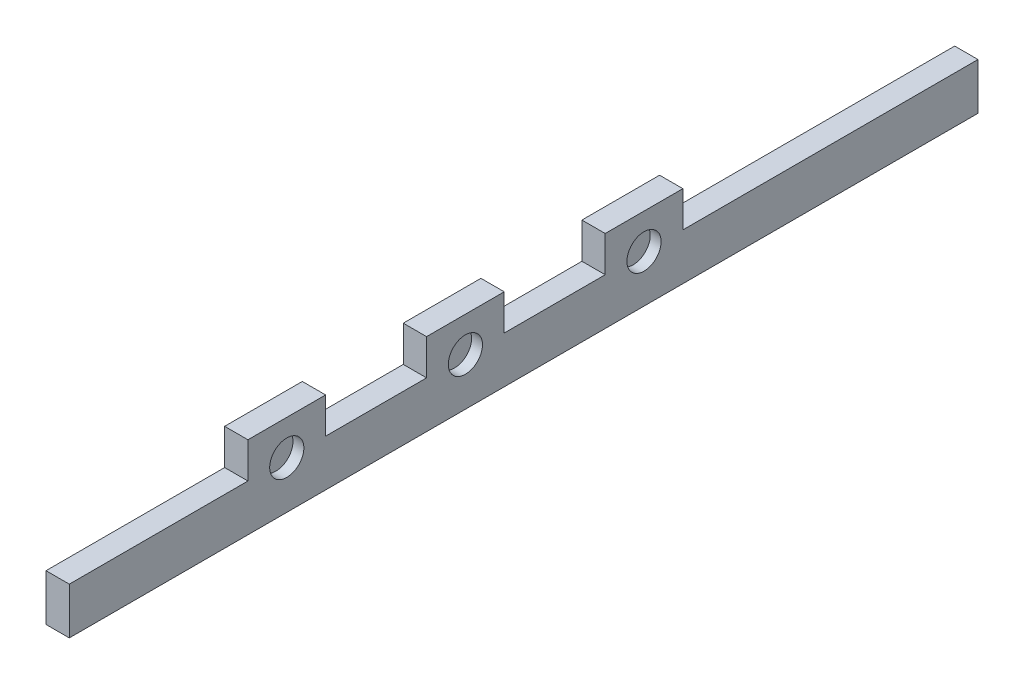
ISO-10303-21;
HEADER;
FILE_DESCRIPTION(('STEP AP214'),'2;1');
FILE_NAME('part.step','',(''),(''),'','','');
FILE_SCHEMA(('AUTOMOTIVE_DESIGN { 1 0 10303 214 1 1 1 1 }'));
ENDSEC;
DATA;
#1=APPLICATION_CONTEXT('core data for automotive mechanical design processes');
#2=APPLICATION_PROTOCOL_DEFINITION('international standard','automotive_design',2000,#1);
#3=PRODUCT_CONTEXT('',#1,'mechanical');
#4=PRODUCT('Part','Part','',(#3));
#5=PRODUCT_RELATED_PRODUCT_CATEGORY('part','',(#4));
#6=PRODUCT_DEFINITION_FORMATION('','',#4);
#7=PRODUCT_DEFINITION_CONTEXT('part definition',#1,'design');
#8=PRODUCT_DEFINITION('design','',#6,#7);
#9=PRODUCT_DEFINITION_SHAPE('','',#8);
#10=(LENGTH_UNIT() NAMED_UNIT(*) SI_UNIT(.MILLI.,.METRE.));
#11=(NAMED_UNIT(*) PLANE_ANGLE_UNIT() SI_UNIT($,.RADIAN.));
#12=(NAMED_UNIT(*) SI_UNIT($,.STERADIAN.) SOLID_ANGLE_UNIT());
#13=UNCERTAINTY_MEASURE_WITH_UNIT(LENGTH_MEASURE(1.E-05),#10,'distance_accuracy_value','');
#14=(GEOMETRIC_REPRESENTATION_CONTEXT(3) GLOBAL_UNCERTAINTY_ASSIGNED_CONTEXT((#13)) GLOBAL_UNIT_ASSIGNED_CONTEXT((#10,
#11,#12)) REPRESENTATION_CONTEXT('',''));
#15=CARTESIAN_POINT('',(0.,0.,0.));
#16=DIRECTION('',(0.,0.,1.));
#17=DIRECTION('',(1.,0.,0.));
#18=AXIS2_PLACEMENT_3D('',#15,#16,#17);
#19=CARTESIAN_POINT('',(15.,30.,12.5));
#20=DIRECTION('',(0.,0.,1.));
#21=DIRECTION('',(1.,0.,0.));
#22=AXIS2_PLACEMENT_3D('',#19,#20,#21);
#23=PLANE('',#22);
#24=DIRECTION('',(0.,1.,0.));
#25=VECTOR('',#24,1.);
#26=CARTESIAN_POINT('',(0.,30.,12.5));
#27=LINE('',#26,#25);
#28=CARTESIAN_POINT('',(0.,30.,12.5));
#29=VERTEX_POINT('',#28);
#30=CARTESIAN_POINT('',(0.,53.,12.5));
#31=VERTEX_POINT('',#30);
#32=EDGE_CURVE('E177',#29,#31,#27,.T.);
#33=ORIENTED_EDGE('',*,*,#32,.T.);
#34=DIRECTION('',(-1.,0.,0.));
#35=VECTOR('',#34,1.);
#36=CARTESIAN_POINT('',(15.,53.,12.5));
#37=LINE('',#36,#35);
#38=CARTESIAN_POINT('',(15.,53.,12.5));
#39=VERTEX_POINT('',#38);
#40=EDGE_CURVE('E11',#39,#31,#37,.T.);
#41=ORIENTED_EDGE('',*,*,#40,.F.);
#42=DIRECTION('',(0.,1.,0.));
#43=VECTOR('',#42,1.);
#44=CARTESIAN_POINT('',(15.,30.,12.5));
#45=LINE('',#44,#43);
#46=CARTESIAN_POINT('',(15.,30.,12.5));
#47=VERTEX_POINT('',#46);
#48=EDGE_CURVE('E208',#47,#39,#45,.T.);
#49=ORIENTED_EDGE('',*,*,#48,.F.);
#50=DIRECTION('',(-1.,0.,0.));
#51=VECTOR('',#50,1.);
#52=CARTESIAN_POINT('',(15.,30.,12.5));
#53=LINE('',#52,#51);
#54=EDGE_CURVE('E173',#47,#29,#53,.T.);
#55=ORIENTED_EDGE('',*,*,#54,.T.);
#56=EDGE_LOOP('',(#33,#41,#49,#55));
#57=FACE_BOUND('',#56,.T.);
#58=ADVANCED_FACE('F33',(#57),#23,.F.);
#59=CARTESIAN_POINT('',(15.,53.,62.5));
#60=DIRECTION('',(0.,-1.,0.));
#61=DIRECTION('',(0.,0.,-1.));
#62=AXIS2_PLACEMENT_3D('',#59,#60,#61);
#63=PLANE('',#62);
#64=DIRECTION('',(0.,0.,1.));
#65=VECTOR('',#64,1.);
#66=CARTESIAN_POINT('',(0.,53.,62.5));
#67=LINE('',#66,#65);
#68=CARTESIAN_POINT('',(0.,53.,62.5));
#69=VERTEX_POINT('',#68);
#70=EDGE_CURVE('E180',#31,#69,#67,.T.);
#71=ORIENTED_EDGE('',*,*,#70,.T.);
#72=DIRECTION('',(-1.,0.,0.));
#73=VECTOR('',#72,1.);
#74=CARTESIAN_POINT('',(15.,53.,62.5));
#75=LINE('',#74,#73);
#76=CARTESIAN_POINT('',(15.,53.,62.5));
#77=VERTEX_POINT('',#76);
#78=EDGE_CURVE('E41',#77,#69,#75,.T.);
#79=ORIENTED_EDGE('',*,*,#78,.F.);
#80=DIRECTION('',(0.,0.,1.));
#81=VECTOR('',#80,1.);
#82=CARTESIAN_POINT('',(15.,53.,62.5));
#83=LINE('',#82,#81);
#84=EDGE_CURVE('E116',#39,#77,#83,.T.);
#85=ORIENTED_EDGE('',*,*,#84,.F.);
#86=ORIENTED_EDGE('',*,*,#40,.T.);
#87=EDGE_LOOP('',(#71,#79,#85,#86));
#88=FACE_BOUND('',#87,.T.);
#89=ADVANCED_FACE('F307',(#88),#63,.F.);
#90=CARTESIAN_POINT('',(15.,30.,62.5));
#91=DIRECTION('',(0.,0.,-1.));
#92=DIRECTION('',(-1.,0.,0.));
#93=AXIS2_PLACEMENT_3D('',#90,#91,#92);
#94=PLANE('',#93);
#95=DIRECTION('',(0.,-1.,0.));
#96=VECTOR('',#95,1.);
#97=CARTESIAN_POINT('',(0.,30.,62.5));
#98=LINE('',#97,#96);
#99=CARTESIAN_POINT('',(0.,30.,62.5));
#100=VERTEX_POINT('',#99);
#101=EDGE_CURVE('E183',#69,#100,#98,.T.);
#102=ORIENTED_EDGE('',*,*,#101,.T.);
#103=DIRECTION('',(-1.,0.,0.));
#104=VECTOR('',#103,1.);
#105=CARTESIAN_POINT('',(15.,30.,62.5));
#106=LINE('',#105,#104);
#107=CARTESIAN_POINT('',(15.,30.,62.5));
#108=VERTEX_POINT('',#107);
#109=EDGE_CURVE('E239',#108,#100,#106,.T.);
#110=ORIENTED_EDGE('',*,*,#109,.F.);
#111=DIRECTION('',(0.,-1.,0.));
#112=VECTOR('',#111,1.);
#113=CARTESIAN_POINT('',(15.,30.,62.5));
#114=LINE('',#113,#112);
#115=EDGE_CURVE('E247',#77,#108,#114,.T.);
#116=ORIENTED_EDGE('',*,*,#115,.F.);
#117=ORIENTED_EDGE('',*,*,#78,.T.);
#118=EDGE_LOOP('',(#102,#110,#116,#117));
#119=FACE_BOUND('',#118,.T.);
#120=ADVANCED_FACE('F245',(#119),#94,.F.);
#121=CARTESIAN_POINT('',(15.,30.,62.5));
#122=DIRECTION('',(0.,-1.,0.));
#123=DIRECTION('',(0.,0.,-1.));
#124=AXIS2_PLACEMENT_3D('',#121,#122,#123);
#125=PLANE('',#124);
#126=DIRECTION('',(0.,0.,1.));
#127=VECTOR('',#126,1.);
#128=CARTESIAN_POINT('',(0.,30.,62.5));
#129=LINE('',#128,#127);
#130=CARTESIAN_POINT('',(0.,30.,127.5));
#131=VERTEX_POINT('',#130);
#132=EDGE_CURVE('E185',#100,#131,#129,.T.);
#133=ORIENTED_EDGE('',*,*,#132,.T.);
#134=DIRECTION('',(-1.,0.,0.));
#135=VECTOR('',#134,1.);
#136=CARTESIAN_POINT('',(15.,30.,127.5));
#137=LINE('',#136,#135);
#138=CARTESIAN_POINT('',(15.,30.,127.5));
#139=VERTEX_POINT('',#138);
#140=EDGE_CURVE('E236',#139,#131,#137,.T.);
#141=ORIENTED_EDGE('',*,*,#140,.F.);
#142=DIRECTION('',(0.,0.,1.));
#143=VECTOR('',#142,1.);
#144=CARTESIAN_POINT('',(15.,30.,62.5));
#145=LINE('',#144,#143);
#146=EDGE_CURVE('E265',#108,#139,#145,.T.);
#147=ORIENTED_EDGE('',*,*,#146,.F.);
#148=ORIENTED_EDGE('',*,*,#109,.T.);
#149=EDGE_LOOP('',(#133,#141,#147,#148));
#150=FACE_BOUND('',#149,.T.);
#151=ADVANCED_FACE('F256',(#150),#125,.F.);
#152=CARTESIAN_POINT('',(15.,30.,127.5));
#153=DIRECTION('',(0.,0.,1.));
#154=DIRECTION('',(1.,0.,0.));
#155=AXIS2_PLACEMENT_3D('',#152,#153,#154);
#156=PLANE('',#155);
#157=DIRECTION('',(0.,1.,0.));
#158=VECTOR('',#157,1.);
#159=CARTESIAN_POINT('',(0.,30.,127.5));
#160=LINE('',#159,#158);
#161=CARTESIAN_POINT('',(0.,53.,127.5));
#162=VERTEX_POINT('',#161);
#163=EDGE_CURVE('E187',#131,#162,#160,.T.);
#164=ORIENTED_EDGE('',*,*,#163,.T.);
#165=DIRECTION('',(-1.,0.,0.));
#166=VECTOR('',#165,1.);
#167=CARTESIAN_POINT('',(15.,53.,127.5));
#168=LINE('',#167,#166);
#169=CARTESIAN_POINT('',(15.,53.,127.5));
#170=VERTEX_POINT('',#169);
#171=EDGE_CURVE('E233',#170,#162,#168,.T.);
#172=ORIENTED_EDGE('',*,*,#171,.F.);
#173=DIRECTION('',(0.,1.,0.));
#174=VECTOR('',#173,1.);
#175=CARTESIAN_POINT('',(15.,30.,127.5));
#176=LINE('',#175,#174);
#177=EDGE_CURVE('E262',#139,#170,#176,.T.);
#178=ORIENTED_EDGE('',*,*,#177,.F.);
#179=ORIENTED_EDGE('',*,*,#140,.T.);
#180=EDGE_LOOP('',(#164,#172,#178,#179));
#181=FACE_BOUND('',#180,.T.);
#182=ADVANCED_FACE('F260',(#181),#156,.F.);
#183=CARTESIAN_POINT('',(15.,53.,177.5));
#184=DIRECTION('',(0.,-1.,0.));
#185=DIRECTION('',(0.,0.,-1.));
#186=AXIS2_PLACEMENT_3D('',#183,#184,#185);
#187=PLANE('',#186);
#188=DIRECTION('',(0.,0.,1.));
#189=VECTOR('',#188,1.);
#190=CARTESIAN_POINT('',(0.,53.,177.5));
#191=LINE('',#190,#189);
#192=CARTESIAN_POINT('',(0.,53.,177.5));
#193=VERTEX_POINT('',#192);
#194=EDGE_CURVE('E189',#162,#193,#191,.T.);
#195=ORIENTED_EDGE('',*,*,#194,.T.);
#196=DIRECTION('',(-1.,0.,0.));
#197=VECTOR('',#196,1.);
#198=CARTESIAN_POINT('',(15.,53.,177.5));
#199=LINE('',#198,#197);
#200=CARTESIAN_POINT('',(15.,53.,177.5));
#201=VERTEX_POINT('',#200);
#202=EDGE_CURVE('E230',#201,#193,#199,.T.);
#203=ORIENTED_EDGE('',*,*,#202,.F.);
#204=DIRECTION('',(0.,0.,1.));
#205=VECTOR('',#204,1.);
#206=CARTESIAN_POINT('',(15.,53.,177.5));
#207=LINE('',#206,#205);
#208=EDGE_CURVE('E264',#170,#201,#207,.T.);
#209=ORIENTED_EDGE('',*,*,#208,.F.);
#210=ORIENTED_EDGE('',*,*,#171,.T.);
#211=EDGE_LOOP('',(#195,#203,#209,#210));
#212=FACE_BOUND('',#211,.T.);
#213=ADVANCED_FACE('F320',(#212),#187,.F.);
#214=CARTESIAN_POINT('',(15.,30.,177.5));
#215=DIRECTION('',(0.,0.,-1.));
#216=DIRECTION('',(-1.,0.,0.));
#217=AXIS2_PLACEMENT_3D('',#214,#215,#216);
#218=PLANE('',#217);
#219=DIRECTION('',(0.,-1.,0.));
#220=VECTOR('',#219,1.);
#221=CARTESIAN_POINT('',(0.,30.,177.5));
#222=LINE('',#221,#220);
#223=CARTESIAN_POINT('',(0.,30.,177.5));
#224=VERTEX_POINT('',#223);
#225=EDGE_CURVE('E191',#193,#224,#222,.T.);
#226=ORIENTED_EDGE('',*,*,#225,.T.);
#227=DIRECTION('',(-1.,0.,0.));
#228=VECTOR('',#227,1.);
#229=CARTESIAN_POINT('',(15.,30.,177.5));
#230=LINE('',#229,#228);
#231=CARTESIAN_POINT('',(15.,30.,177.5));
#232=VERTEX_POINT('',#231);
#233=EDGE_CURVE('E227',#232,#224,#230,.T.);
#234=ORIENTED_EDGE('',*,*,#233,.F.);
#235=DIRECTION('',(0.,-1.,0.));
#236=VECTOR('',#235,1.);
#237=CARTESIAN_POINT('',(15.,30.,177.5));
#238=LINE('',#237,#236);
#239=EDGE_CURVE('E267',#201,#232,#238,.T.);
#240=ORIENTED_EDGE('',*,*,#239,.F.);
#241=ORIENTED_EDGE('',*,*,#202,.T.);
#242=EDGE_LOOP('',(#226,#234,#240,#241));
#243=FACE_BOUND('',#242,.T.);
#244=ADVANCED_FACE('F323',(#243),#218,.F.);
#245=CARTESIAN_POINT('',(15.,30.,177.5));
#246=DIRECTION('',(0.,-1.,0.));
#247=DIRECTION('',(0.,0.,-1.));
#248=AXIS2_PLACEMENT_3D('',#245,#246,#247);
#249=PLANE('',#248);
#250=DIRECTION('',(0.,0.,1.));
#251=VECTOR('',#250,1.);
#252=CARTESIAN_POINT('',(0.,30.,177.5));
#253=LINE('',#252,#251);
#254=CARTESIAN_POINT('',(0.,30.,292.5));
#255=VERTEX_POINT('',#254);
#256=EDGE_CURVE('E193',#224,#255,#253,.T.);
#257=ORIENTED_EDGE('',*,*,#256,.T.);
#258=DIRECTION('',(-1.,0.,0.));
#259=VECTOR('',#258,1.);
#260=CARTESIAN_POINT('',(15.,30.,292.5));
#261=LINE('',#260,#259);
#262=CARTESIAN_POINT('',(15.,30.,292.5));
#263=VERTEX_POINT('',#262);
#264=EDGE_CURVE('E224',#263,#255,#261,.T.);
#265=ORIENTED_EDGE('',*,*,#264,.F.);
#266=DIRECTION('',(0.,0.,1.));
#267=VECTOR('',#266,1.);
#268=CARTESIAN_POINT('',(15.,30.,177.5));
#269=LINE('',#268,#267);
#270=EDGE_CURVE('E273',#232,#263,#269,.T.);
#271=ORIENTED_EDGE('',*,*,#270,.F.);
#272=ORIENTED_EDGE('',*,*,#233,.T.);
#273=EDGE_LOOP('',(#257,#265,#271,#272));
#274=FACE_BOUND('',#273,.T.);
#275=ADVANCED_FACE('F327',(#274),#249,.F.);
#276=CARTESIAN_POINT('',(15.,0.,292.5));
#277=DIRECTION('',(0.,0.,-1.));
#278=DIRECTION('',(-1.,0.,0.));
#279=AXIS2_PLACEMENT_3D('',#276,#277,#278);
#280=PLANE('',#279);
#281=DIRECTION('',(0.,-1.,0.));
#282=VECTOR('',#281,1.);
#283=CARTESIAN_POINT('',(0.,0.,292.5));
#284=LINE('',#283,#282);
#285=CARTESIAN_POINT('',(0.,0.,292.5));
#286=VERTEX_POINT('',#285);
#287=EDGE_CURVE('E195',#255,#286,#284,.T.);
#288=ORIENTED_EDGE('',*,*,#287,.T.);
#289=DIRECTION('',(-1.,0.,0.));
#290=VECTOR('',#289,1.);
#291=CARTESIAN_POINT('',(15.,0.,292.5));
#292=LINE('',#291,#290);
#293=CARTESIAN_POINT('',(15.,0.,292.5));
#294=VERTEX_POINT('',#293);
#295=EDGE_CURVE('E221',#294,#286,#292,.T.);
#296=ORIENTED_EDGE('',*,*,#295,.F.);
#297=DIRECTION('',(0.,-1.,0.));
#298=VECTOR('',#297,1.);
#299=CARTESIAN_POINT('',(15.,0.,292.5));
#300=LINE('',#299,#298);
#301=EDGE_CURVE('E275',#263,#294,#300,.T.);
#302=ORIENTED_EDGE('',*,*,#301,.F.);
#303=ORIENTED_EDGE('',*,*,#264,.T.);
#304=EDGE_LOOP('',(#288,#296,#302,#303));
#305=FACE_BOUND('',#304,.T.);
#306=ADVANCED_FACE('F331',(#305),#280,.F.);
#307=CARTESIAN_POINT('',(15.,0.,292.5));
#308=DIRECTION('',(0.,1.,0.));
#309=DIRECTION('',(0.,0.,1.));
#310=AXIS2_PLACEMENT_3D('',#307,#308,#309);
#311=PLANE('',#310);
#312=DIRECTION('',(0.,0.,-1.));
#313=VECTOR('',#312,1.);
#314=CARTESIAN_POINT('',(0.,0.,292.5));
#315=LINE('',#314,#313);
#316=CARTESIAN_POINT('',(0.,1.0746275662518E-13,-292.5));
#317=VERTEX_POINT('',#316);
#318=EDGE_CURVE('E197',#286,#317,#315,.T.);
#319=ORIENTED_EDGE('',*,*,#318,.T.);
#320=DIRECTION('',(-1.,0.,0.));
#321=VECTOR('',#320,1.);
#322=CARTESIAN_POINT('',(15.,1.0746275662518E-13,-292.5));
#323=LINE('',#322,#321);
#324=CARTESIAN_POINT('',(15.,1.0746275662518E-13,-292.5));
#325=VERTEX_POINT('',#324);
#326=EDGE_CURVE('E218',#325,#317,#323,.T.);
#327=ORIENTED_EDGE('',*,*,#326,.F.);
#328=DIRECTION('',(0.,0.,-1.));
#329=VECTOR('',#328,1.);
#330=CARTESIAN_POINT('',(15.,0.,292.5));
#331=LINE('',#330,#329);
#332=EDGE_CURVE('E277',#294,#325,#331,.T.);
#333=ORIENTED_EDGE('',*,*,#332,.F.);
#334=ORIENTED_EDGE('',*,*,#295,.T.);
#335=EDGE_LOOP('',(#319,#327,#333,#334));
#336=FACE_BOUND('',#335,.T.);
#337=ADVANCED_FACE('F335',(#336),#311,.F.);
#338=CARTESIAN_POINT('',(15.,1.0746275662518E-13,-292.5));
#339=DIRECTION('',(0.,0.,1.));
#340=DIRECTION('',(1.,0.,0.));
#341=AXIS2_PLACEMENT_3D('',#338,#339,#340);
#342=PLANE('',#341);
#343=DIRECTION('',(0.,1.,0.));
#344=VECTOR('',#343,1.);
#345=CARTESIAN_POINT('',(0.,1.0746275662518E-13,-292.5));
#346=LINE('',#345,#344);
#347=CARTESIAN_POINT('',(0.,30.0000000000001,-292.5));
#348=VERTEX_POINT('',#347);
#349=EDGE_CURVE('E199',#317,#348,#346,.T.);
#350=ORIENTED_EDGE('',*,*,#349,.T.);
#351=DIRECTION('',(-1.,0.,0.));
#352=VECTOR('',#351,1.);
#353=CARTESIAN_POINT('',(15.,30.0000000000001,-292.5));
#354=LINE('',#353,#352);
#355=CARTESIAN_POINT('',(15.,30.0000000000001,-292.5));
#356=VERTEX_POINT('',#355);
#357=EDGE_CURVE('E215',#356,#348,#354,.T.);
#358=ORIENTED_EDGE('',*,*,#357,.F.);
#359=DIRECTION('',(0.,1.,0.));
#360=VECTOR('',#359,1.);
#361=CARTESIAN_POINT('',(15.,1.0746275662518E-13,-292.5));
#362=LINE('',#361,#360);
#363=EDGE_CURVE('E279',#325,#356,#362,.T.);
#364=ORIENTED_EDGE('',*,*,#363,.F.);
#365=ORIENTED_EDGE('',*,*,#326,.T.);
#366=EDGE_LOOP('',(#350,#358,#364,#365));
#367=FACE_BOUND('',#366,.T.);
#368=ADVANCED_FACE('F339',(#367),#342,.F.);
#369=CARTESIAN_POINT('',(15.,30.,-102.5));
#370=DIRECTION('',(0.,-1.,0.));
#371=DIRECTION('',(0.,0.,-1.));
#372=AXIS2_PLACEMENT_3D('',#369,#370,#371);
#373=PLANE('',#372);
#374=DIRECTION('',(0.,0.,1.));
#375=VECTOR('',#374,1.);
#376=CARTESIAN_POINT('',(0.,30.,-102.5));
#377=LINE('',#376,#375);
#378=CARTESIAN_POINT('',(0.,30.,-102.5));
#379=VERTEX_POINT('',#378);
#380=EDGE_CURVE('E201',#348,#379,#377,.T.);
#381=ORIENTED_EDGE('',*,*,#380,.T.);
#382=DIRECTION('',(-1.,0.,0.));
#383=VECTOR('',#382,1.);
#384=CARTESIAN_POINT('',(15.,30.,-102.5));
#385=LINE('',#384,#383);
#386=CARTESIAN_POINT('',(15.,30.,-102.5));
#387=VERTEX_POINT('',#386);
#388=EDGE_CURVE('E212',#387,#379,#385,.T.);
#389=ORIENTED_EDGE('',*,*,#388,.F.);
#390=DIRECTION('',(0.,0.,1.));
#391=VECTOR('',#390,1.);
#392=CARTESIAN_POINT('',(15.,30.,-102.5));
#393=LINE('',#392,#391);
#394=EDGE_CURVE('E281',#356,#387,#393,.T.);
#395=ORIENTED_EDGE('',*,*,#394,.F.);
#396=ORIENTED_EDGE('',*,*,#357,.T.);
#397=EDGE_LOOP('',(#381,#389,#395,#396));
#398=FACE_BOUND('',#397,.T.);
#399=ADVANCED_FACE('F287',(#398),#373,.F.);
#400=CARTESIAN_POINT('',(15.,30.,-102.5));
#401=DIRECTION('',(0.,0.,1.));
#402=DIRECTION('',(1.,0.,0.));
#403=AXIS2_PLACEMENT_3D('',#400,#401,#402);
#404=PLANE('',#403);
#405=DIRECTION('',(0.,1.,0.));
#406=VECTOR('',#405,1.);
#407=CARTESIAN_POINT('',(0.,30.,-102.5));
#408=LINE('',#407,#406);
#409=CARTESIAN_POINT('',(0.,53.,-102.5));
#410=VERTEX_POINT('',#409);
#411=EDGE_CURVE('E203',#379,#410,#408,.T.);
#412=ORIENTED_EDGE('',*,*,#411,.T.);
#413=DIRECTION('',(-1.,0.,0.));
#414=VECTOR('',#413,1.);
#415=CARTESIAN_POINT('',(15.,53.,-102.5));
#416=LINE('',#415,#414);
#417=CARTESIAN_POINT('',(15.,53.,-102.5));
#418=VERTEX_POINT('',#417);
#419=EDGE_CURVE('E168',#418,#410,#416,.T.);
#420=ORIENTED_EDGE('',*,*,#419,.F.);
#421=DIRECTION('',(0.,1.,0.));
#422=VECTOR('',#421,1.);
#423=CARTESIAN_POINT('',(15.,30.,-102.5));
#424=LINE('',#423,#422);
#425=EDGE_CURVE('E159',#387,#418,#424,.T.);
#426=ORIENTED_EDGE('',*,*,#425,.F.);
#427=ORIENTED_EDGE('',*,*,#388,.T.);
#428=EDGE_LOOP('',(#412,#420,#426,#427));
#429=FACE_BOUND('',#428,.T.);
#430=ADVANCED_FACE('F291',(#429),#404,.F.);
#431=CARTESIAN_POINT('',(15.,53.,-52.5));
#432=DIRECTION('',(0.,-1.,0.));
#433=DIRECTION('',(0.,0.,-1.));
#434=AXIS2_PLACEMENT_3D('',#431,#432,#433);
#435=PLANE('',#434);
#436=DIRECTION('',(0.,0.,1.));
#437=VECTOR('',#436,1.);
#438=CARTESIAN_POINT('',(0.,53.,-52.5));
#439=LINE('',#438,#437);
#440=CARTESIAN_POINT('',(0.,53.,-52.5));
#441=VERTEX_POINT('',#440);
#442=EDGE_CURVE('E167',#410,#441,#439,.T.);
#443=ORIENTED_EDGE('',*,*,#442,.T.);
#444=DIRECTION('',(-1.,0.,0.));
#445=VECTOR('',#444,1.);
#446=CARTESIAN_POINT('',(15.,53.,-52.5));
#447=LINE('',#446,#445);
#448=CARTESIAN_POINT('',(15.,53.,-52.5));
#449=VERTEX_POINT('',#448);
#450=EDGE_CURVE('E164',#449,#441,#447,.T.);
#451=ORIENTED_EDGE('',*,*,#450,.F.);
#452=DIRECTION('',(0.,0.,1.));
#453=VECTOR('',#452,1.);
#454=CARTESIAN_POINT('',(15.,53.,-52.5));
#455=LINE('',#454,#453);
#456=EDGE_CURVE('E153',#418,#449,#455,.T.);
#457=ORIENTED_EDGE('',*,*,#456,.F.);
#458=ORIENTED_EDGE('',*,*,#419,.T.);
#459=EDGE_LOOP('',(#443,#451,#457,#458));
#460=FACE_BOUND('',#459,.T.);
#461=ADVANCED_FACE('F165',(#460),#435,.F.);
#462=CARTESIAN_POINT('',(15.,30.,-52.5));
#463=DIRECTION('',(0.,0.,-1.));
#464=DIRECTION('',(-1.,0.,0.));
#465=AXIS2_PLACEMENT_3D('',#462,#463,#464);
#466=PLANE('',#465);
#467=DIRECTION('',(0.,-1.,0.));
#468=VECTOR('',#467,1.);
#469=CARTESIAN_POINT('',(0.,30.,-52.5));
#470=LINE('',#469,#468);
#471=CARTESIAN_POINT('',(0.,30.,-52.5));
#472=VERTEX_POINT('',#471);
#473=EDGE_CURVE('E102',#441,#472,#470,.T.);
#474=ORIENTED_EDGE('',*,*,#473,.T.);
#475=DIRECTION('',(-1.,0.,0.));
#476=VECTOR('',#475,1.);
#477=CARTESIAN_POINT('',(15.,30.,-52.5));
#478=LINE('',#477,#476);
#479=CARTESIAN_POINT('',(15.,30.,-52.5));
#480=VERTEX_POINT('',#479);
#481=EDGE_CURVE('E169',#480,#472,#478,.T.);
#482=ORIENTED_EDGE('',*,*,#481,.F.);
#483=DIRECTION('',(0.,-1.,0.));
#484=VECTOR('',#483,1.);
#485=CARTESIAN_POINT('',(15.,30.,-52.5));
#486=LINE('',#485,#484);
#487=EDGE_CURVE('E157',#449,#480,#486,.T.);
#488=ORIENTED_EDGE('',*,*,#487,.F.);
#489=ORIENTED_EDGE('',*,*,#450,.T.);
#490=EDGE_LOOP('',(#474,#482,#488,#489));
#491=FACE_BOUND('',#490,.T.);
#492=ADVANCED_FACE('F171',(#491),#466,.F.);
#493=CARTESIAN_POINT('',(15.,30.,12.5));
#494=DIRECTION('',(0.,-1.,0.));
#495=DIRECTION('',(0.,0.,-1.));
#496=AXIS2_PLACEMENT_3D('',#493,#494,#495);
#497=PLANE('',#496);
#498=DIRECTION('',(0.,0.,1.));
#499=VECTOR('',#498,1.);
#500=CARTESIAN_POINT('',(0.,30.,12.5));
#501=LINE('',#500,#499);
#502=EDGE_CURVE('E108',#472,#29,#501,.T.);
#503=ORIENTED_EDGE('',*,*,#502,.T.);
#504=ORIENTED_EDGE('',*,*,#54,.F.);
#505=DIRECTION('',(0.,0.,1.));
#506=VECTOR('',#505,1.);
#507=CARTESIAN_POINT('',(15.,30.,12.5));
#508=LINE('',#507,#506);
#509=EDGE_CURVE('E49',#480,#47,#508,.T.);
#510=ORIENTED_EDGE('',*,*,#509,.F.);
#511=ORIENTED_EDGE('',*,*,#481,.T.);
#512=EDGE_LOOP('',(#503,#504,#510,#511));
#513=FACE_BOUND('',#512,.T.);
#514=ADVANCED_FACE('F295',(#513),#497,.F.);
#515=CARTESIAN_POINT('',(15.,0.,0.));
#516=DIRECTION('',(-1.,0.,0.));
#517=DIRECTION('',(0.,0.,1.));
#518=AXIS2_PLACEMENT_3D('',#515,#516,#517);
#519=PLANE('',#518);
#520=CARTESIAN_POINT('',(15.,30.5,-77.5));
#521=DIRECTION('',(1.,0.,0.));
#522=DIRECTION('',(0.,0.,-1.));
#523=AXIS2_PLACEMENT_3D('',#520,#521,#522);
#524=CIRCLE('',#523,11.);
#525=CARTESIAN_POINT('',(15.,30.5,-88.5));
#526=VERTEX_POINT('',#525);
#527=EDGE_CURVE('E442',#526,#526,#524,.T.);
#528=ORIENTED_EDGE('',*,*,#527,.F.);
#529=EDGE_LOOP('',(#528));
#530=FACE_BOUND('',#529,.T.);
#531=CARTESIAN_POINT('',(15.,30.5,152.5));
#532=DIRECTION('',(1.,0.,0.));
#533=DIRECTION('',(0.,0.,-1.));
#534=AXIS2_PLACEMENT_3D('',#531,#532,#533);
#535=CIRCLE('',#534,11.);
#536=CARTESIAN_POINT('',(15.,30.5,141.5));
#537=VERTEX_POINT('',#536);
#538=EDGE_CURVE('E441',#537,#537,#535,.T.);
#539=ORIENTED_EDGE('',*,*,#538,.F.);
#540=EDGE_LOOP('',(#539));
#541=FACE_BOUND('',#540,.T.);
#542=CARTESIAN_POINT('',(15.,30.5,37.5));
#543=DIRECTION('',(1.,0.,0.));
#544=DIRECTION('',(0.,0.,-1.));
#545=AXIS2_PLACEMENT_3D('',#542,#543,#544);
#546=CIRCLE('',#545,11.);
#547=CARTESIAN_POINT('',(15.,30.5,26.5));
#548=VERTEX_POINT('',#547);
#549=EDGE_CURVE('E451',#548,#548,#546,.T.);
#550=ORIENTED_EDGE('',*,*,#549,.F.);
#551=EDGE_LOOP('',(#550));
#552=FACE_BOUND('',#551,.T.);
#553=ORIENTED_EDGE('',*,*,#48,.T.);
#554=ORIENTED_EDGE('',*,*,#84,.T.);
#555=ORIENTED_EDGE('',*,*,#115,.T.);
#556=ORIENTED_EDGE('',*,*,#146,.T.);
#557=ORIENTED_EDGE('',*,*,#177,.T.);
#558=ORIENTED_EDGE('',*,*,#208,.T.);
#559=ORIENTED_EDGE('',*,*,#239,.T.);
#560=ORIENTED_EDGE('',*,*,#270,.T.);
#561=ORIENTED_EDGE('',*,*,#301,.T.);
#562=ORIENTED_EDGE('',*,*,#332,.T.);
#563=ORIENTED_EDGE('',*,*,#363,.T.);
#564=ORIENTED_EDGE('',*,*,#394,.T.);
#565=ORIENTED_EDGE('',*,*,#425,.T.);
#566=ORIENTED_EDGE('',*,*,#456,.T.);
#567=ORIENTED_EDGE('',*,*,#487,.T.);
#568=ORIENTED_EDGE('',*,*,#509,.T.);
#569=EDGE_LOOP('',(#553,#554,#555,#556,#557,#558,#559,#560,#561,#562,#563,#564,#565,#566,#567,#568));
#570=FACE_BOUND('',#569,.T.);
#571=ADVANCED_FACE('F155',(#530,#541,#552,#570),#519,.F.);
#572=CARTESIAN_POINT('',(0.,0.,0.));
#573=DIRECTION('',(-1.,0.,0.));
#574=DIRECTION('',(0.,0.,1.));
#575=AXIS2_PLACEMENT_3D('',#572,#573,#574);
#576=PLANE('',#575);
#577=ORIENTED_EDGE('',*,*,#32,.F.);
#578=ORIENTED_EDGE('',*,*,#502,.F.);
#579=ORIENTED_EDGE('',*,*,#473,.F.);
#580=ORIENTED_EDGE('',*,*,#442,.F.);
#581=ORIENTED_EDGE('',*,*,#411,.F.);
#582=ORIENTED_EDGE('',*,*,#380,.F.);
#583=ORIENTED_EDGE('',*,*,#349,.F.);
#584=ORIENTED_EDGE('',*,*,#318,.F.);
#585=ORIENTED_EDGE('',*,*,#287,.F.);
#586=ORIENTED_EDGE('',*,*,#256,.F.);
#587=ORIENTED_EDGE('',*,*,#225,.F.);
#588=ORIENTED_EDGE('',*,*,#194,.F.);
#589=ORIENTED_EDGE('',*,*,#163,.F.);
#590=ORIENTED_EDGE('',*,*,#132,.F.);
#591=ORIENTED_EDGE('',*,*,#101,.F.);
#592=ORIENTED_EDGE('',*,*,#70,.F.);
#593=EDGE_LOOP('',(#577,#578,#579,#580,#581,#582,#583,#584,#585,#586,#587,#588,#589,#590,#591,#592));
#594=FACE_BOUND('',#593,.T.);
#595=ADVANCED_FACE('F251',(#594),#576,.T.);
#596=CARTESIAN_POINT('',(8.,30.5,37.5));
#597=DIRECTION('',(1.,0.,0.));
#598=DIRECTION('',(0.,0.,-1.));
#599=AXIS2_PLACEMENT_3D('',#596,#597,#598);
#600=CYLINDRICAL_SURFACE('',#599,11.);
#601=CARTESIAN_POINT('',(8.,30.5,37.5));
#602=DIRECTION('',(1.,0.,0.));
#603=DIRECTION('',(0.,0.,-1.));
#604=AXIS2_PLACEMENT_3D('',#601,#602,#603);
#605=CIRCLE('',#604,11.);
#606=CARTESIAN_POINT('',(8.,30.5,26.5));
#607=VERTEX_POINT('',#606);
#608=EDGE_CURVE('E181',#607,#607,#605,.T.);
#609=ORIENTED_EDGE('',*,*,#608,.F.);
#610=EDGE_LOOP('',(#609));
#611=FACE_BOUND('',#610,.T.);
#612=ORIENTED_EDGE('',*,*,#549,.T.);
#613=EDGE_LOOP('',(#612));
#614=FACE_BOUND('',#613,.T.);
#615=ADVANCED_FACE('F371',(#611,#614),#600,.F.);
#616=CARTESIAN_POINT('',(8.,30.5,37.5));
#617=DIRECTION('',(1.,0.,0.));
#618=DIRECTION('',(0.,0.,-1.));
#619=AXIS2_PLACEMENT_3D('',#616,#617,#618);
#620=PLANE('',#619);
#621=ORIENTED_EDGE('',*,*,#608,.T.);
#622=EDGE_LOOP('',(#621));
#623=FACE_BOUND('',#622,.T.);
#624=ADVANCED_FACE('F384',(#623),#620,.T.);
#625=CARTESIAN_POINT('',(8.,30.5,152.5));
#626=DIRECTION('',(1.,0.,0.));
#627=DIRECTION('',(0.,0.,-1.));
#628=AXIS2_PLACEMENT_3D('',#625,#626,#627);
#629=CYLINDRICAL_SURFACE('',#628,11.);
#630=CARTESIAN_POINT('',(8.,30.5,152.5));
#631=DIRECTION('',(1.,0.,0.));
#632=DIRECTION('',(0.,0.,-1.));
#633=AXIS2_PLACEMENT_3D('',#630,#631,#632);
#634=CIRCLE('',#633,11.);
#635=CARTESIAN_POINT('',(8.,30.5,141.5));
#636=VERTEX_POINT('',#635);
#637=EDGE_CURVE('E445',#636,#636,#634,.T.);
#638=ORIENTED_EDGE('',*,*,#637,.F.);
#639=EDGE_LOOP('',(#638));
#640=FACE_BOUND('',#639,.T.);
#641=ORIENTED_EDGE('',*,*,#538,.T.);
#642=EDGE_LOOP('',(#641));
#643=FACE_BOUND('',#642,.T.);
#644=ADVANCED_FACE('F394',(#640,#643),#629,.F.);
#645=CARTESIAN_POINT('',(8.,30.5,152.5));
#646=DIRECTION('',(1.,0.,0.));
#647=DIRECTION('',(0.,0.,-1.));
#648=AXIS2_PLACEMENT_3D('',#645,#646,#647);
#649=PLANE('',#648);
#650=ORIENTED_EDGE('',*,*,#637,.T.);
#651=EDGE_LOOP('',(#650));
#652=FACE_BOUND('',#651,.T.);
#653=ADVANCED_FACE('F404',(#652),#649,.T.);
#654=CARTESIAN_POINT('',(8.,30.5,-77.5));
#655=DIRECTION('',(1.,0.,0.));
#656=DIRECTION('',(0.,0.,-1.));
#657=AXIS2_PLACEMENT_3D('',#654,#655,#656);
#658=CYLINDRICAL_SURFACE('',#657,11.);
#659=CARTESIAN_POINT('',(8.,30.5,-77.5));
#660=DIRECTION('',(1.,0.,0.));
#661=DIRECTION('',(0.,0.,-1.));
#662=AXIS2_PLACEMENT_3D('',#659,#660,#661);
#663=CIRCLE('',#662,11.);
#664=CARTESIAN_POINT('',(8.,30.5,-88.5));
#665=VERTEX_POINT('',#664);
#666=EDGE_CURVE('E440',#665,#665,#663,.T.);
#667=ORIENTED_EDGE('',*,*,#666,.F.);
#668=EDGE_LOOP('',(#667));
#669=FACE_BOUND('',#668,.T.);
#670=ORIENTED_EDGE('',*,*,#527,.T.);
#671=EDGE_LOOP('',(#670));
#672=FACE_BOUND('',#671,.T.);
#673=ADVANCED_FACE('F414',(#669,#672),#658,.F.);
#674=CARTESIAN_POINT('',(8.,30.5,-77.5));
#675=DIRECTION('',(1.,0.,0.));
#676=DIRECTION('',(0.,0.,-1.));
#677=AXIS2_PLACEMENT_3D('',#674,#675,#676);
#678=PLANE('',#677);
#679=ORIENTED_EDGE('',*,*,#666,.T.);
#680=EDGE_LOOP('',(#679));
#681=FACE_BOUND('',#680,.T.);
#682=ADVANCED_FACE('F424',(#681),#678,.T.);
#683=CLOSED_SHELL('',(#58,#89,#120,#151,#182,#213,#244,#275,#306,#337,#368,#399,#430,#461,#492,
#514,#571,#595,#615,#624,#644,#653,#673,#682));
#684=MANIFOLD_SOLID_BREP('B2',#683);
#685=ADVANCED_BREP_SHAPE_REPRESENTATION('',(#18,#684),#14);
#686=SHAPE_DEFINITION_REPRESENTATION(#9,#685);
ENDSEC;
END-ISO-10303-21;
